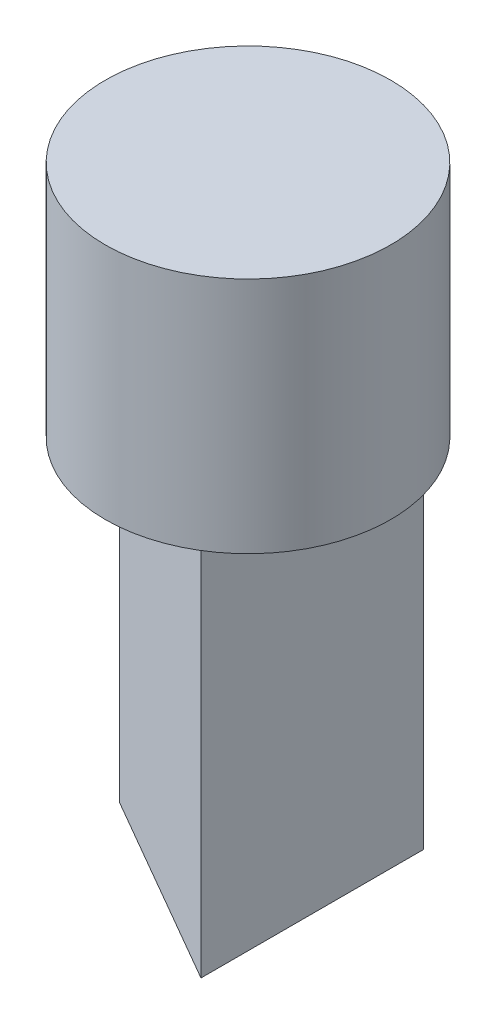
ISO-10303-21;
HEADER;
FILE_DESCRIPTION(('STEP AP214'),'2;1');
FILE_NAME('part.step','',(''),(''),'','','');
FILE_SCHEMA(('AUTOMOTIVE_DESIGN { 1 0 10303 214 1 1 1 1 }'));
ENDSEC;
DATA;
#1=APPLICATION_CONTEXT('core data for automotive mechanical design processes');
#2=APPLICATION_PROTOCOL_DEFINITION('international standard','automotive_design',2000,#1);
#3=PRODUCT_CONTEXT('',#1,'mechanical');
#4=PRODUCT('Part','Part','',(#3));
#5=PRODUCT_RELATED_PRODUCT_CATEGORY('part','',(#4));
#6=PRODUCT_DEFINITION_FORMATION('','',#4);
#7=PRODUCT_DEFINITION_CONTEXT('part definition',#1,'design');
#8=PRODUCT_DEFINITION('design','',#6,#7);
#9=PRODUCT_DEFINITION_SHAPE('','',#8);
#10=(LENGTH_UNIT() NAMED_UNIT(*) SI_UNIT(.MILLI.,.METRE.));
#11=(NAMED_UNIT(*) PLANE_ANGLE_UNIT() SI_UNIT($,.RADIAN.));
#12=(NAMED_UNIT(*) SI_UNIT($,.STERADIAN.) SOLID_ANGLE_UNIT());
#13=UNCERTAINTY_MEASURE_WITH_UNIT(LENGTH_MEASURE(1.E-05),#10,'distance_accuracy_value','');
#14=(GEOMETRIC_REPRESENTATION_CONTEXT(3) GLOBAL_UNCERTAINTY_ASSIGNED_CONTEXT((#13)) GLOBAL_UNIT_ASSIGNED_CONTEXT((#10,
#11,#12)) REPRESENTATION_CONTEXT('',''));
#15=CARTESIAN_POINT('',(0.,0.,0.));
#16=DIRECTION('',(0.,0.,1.));
#17=DIRECTION('',(1.,0.,0.));
#18=AXIS2_PLACEMENT_3D('',#15,#16,#17);
#19=CARTESIAN_POINT('',(0.,0.,0.));
#20=DIRECTION('',(0.,1.,0.));
#21=DIRECTION('',(0.,0.,1.));
#22=AXIS2_PLACEMENT_3D('',#19,#20,#21);
#23=PLANE('',#22);
#24=CARTESIAN_POINT('',(0.,0.,0.));
#25=DIRECTION('',(0.,1.,0.));
#26=DIRECTION('',(0.,0.,1.));
#27=AXIS2_PLACEMENT_3D('',#24,#25,#26);
#28=CIRCLE('',#27,3.);
#29=CARTESIAN_POINT('',(0.,0.,3.));
#30=VERTEX_POINT('',#29);
#31=EDGE_CURVE('E39',#30,#30,#28,.T.);
#32=ORIENTED_EDGE('',*,*,#31,.F.);
#33=EDGE_LOOP('',(#32));
#34=FACE_BOUND('',#33,.T.);
#35=DIRECTION('',(0.,0.,1.));
#36=VECTOR('',#35,1.);
#37=CARTESIAN_POINT('',(1.34999999999998,0.,0.));
#38=LINE('',#37,#36);
#39=CARTESIAN_POINT('',(1.34999999999998,0.,-2.338268590218));
#40=VERTEX_POINT('',#39);
#41=CARTESIAN_POINT('',(1.34999999999998,0.,2.338268590218));
#42=VERTEX_POINT('',#41);
#43=EDGE_CURVE('E50',#40,#42,#38,.T.);
#44=ORIENTED_EDGE('',*,*,#43,.F.);
#45=DIRECTION('',(0.866025403784436,0.,-0.500000000000004));
#46=VECTOR('',#45,1.);
#47=CARTESIAN_POINT('',(-0.675000000000011,0.,-1.169134295109));
#48=LINE('',#47,#46);
#49=CARTESIAN_POINT('',(-2.7,0.,0.));
#50=VERTEX_POINT('',#49);
#51=EDGE_CURVE('E85',#50,#40,#48,.T.);
#52=ORIENTED_EDGE('',*,*,#51,.F.);
#53=DIRECTION('',(-0.866025403784436,0.,-0.500000000000004));
#54=VECTOR('',#53,1.);
#55=CARTESIAN_POINT('',(-0.675000000000011,0.,1.169134295109));
#56=LINE('',#55,#54);
#57=EDGE_CURVE('E54',#42,#50,#56,.T.);
#58=ORIENTED_EDGE('',*,*,#57,.F.);
#59=EDGE_LOOP('',(#44,#52,#58));
#60=FACE_BOUND('',#59,.T.);
#61=ADVANCED_FACE('F35',(#34,#60),#23,.F.);
#62=CARTESIAN_POINT('',(0.,5.,0.));
#63=DIRECTION('',(0.,-1.,0.));
#64=DIRECTION('',(0.,0.,-1.));
#65=AXIS2_PLACEMENT_3D('',#62,#63,#64);
#66=CYLINDRICAL_SURFACE('',#65,3.);
#67=CARTESIAN_POINT('',(0.,5.,0.));
#68=DIRECTION('',(0.,1.,0.));
#69=DIRECTION('',(0.,0.,1.));
#70=AXIS2_PLACEMENT_3D('',#67,#68,#69);
#71=CIRCLE('',#70,3.);
#72=CARTESIAN_POINT('',(0.,5.,3.));
#73=VERTEX_POINT('',#72);
#74=EDGE_CURVE('E11',#73,#73,#71,.T.);
#75=ORIENTED_EDGE('',*,*,#74,.F.);
#76=EDGE_LOOP('',(#75));
#77=FACE_BOUND('',#76,.T.);
#78=ORIENTED_EDGE('',*,*,#31,.T.);
#79=EDGE_LOOP('',(#78));
#80=FACE_BOUND('',#79,.T.);
#81=ADVANCED_FACE('F37',(#77,#80),#66,.T.);
#82=CARTESIAN_POINT('',(0.,5.,0.));
#83=DIRECTION('',(0.,1.,0.));
#84=DIRECTION('',(0.,0.,1.));
#85=AXIS2_PLACEMENT_3D('',#82,#83,#84);
#86=PLANE('',#85);
#87=ORIENTED_EDGE('',*,*,#74,.T.);
#88=EDGE_LOOP('',(#87));
#89=FACE_BOUND('',#88,.T.);
#90=ADVANCED_FACE('F104',(#89),#86,.T.);
#91=CARTESIAN_POINT('',(1.34999999999998,-8.,0.));
#92=DIRECTION('',(-1.,0.,0.));
#93=DIRECTION('',(0.,0.,1.));
#94=AXIS2_PLACEMENT_3D('',#91,#92,#93);
#95=PLANE('',#94);
#96=ORIENTED_EDGE('',*,*,#43,.T.);
#97=DIRECTION('',(0.,1.,0.));
#98=VECTOR('',#97,1.);
#99=CARTESIAN_POINT('',(1.34999999999998,-8.,2.338268590218));
#100=LINE('',#99,#98);
#101=CARTESIAN_POINT('',(1.34999999999998,-8.,2.338268590218));
#102=VERTEX_POINT('',#101);
#103=EDGE_CURVE('E72',#102,#42,#100,.T.);
#104=ORIENTED_EDGE('',*,*,#103,.F.);
#105=DIRECTION('',(0.,0.,1.));
#106=VECTOR('',#105,1.);
#107=CARTESIAN_POINT('',(1.34999999999998,-8.,0.));
#108=LINE('',#107,#106);
#109=CARTESIAN_POINT('',(1.34999999999998,-8.,-2.338268590218));
#110=VERTEX_POINT('',#109);
#111=EDGE_CURVE('E78',#110,#102,#108,.T.);
#112=ORIENTED_EDGE('',*,*,#111,.F.);
#113=DIRECTION('',(0.,1.,0.));
#114=VECTOR('',#113,1.);
#115=CARTESIAN_POINT('',(1.34999999999998,-8.,-2.338268590218));
#116=LINE('',#115,#114);
#117=EDGE_CURVE('E90',#110,#40,#116,.T.);
#118=ORIENTED_EDGE('',*,*,#117,.T.);
#119=EDGE_LOOP('',(#96,#104,#112,#118));
#120=FACE_BOUND('',#119,.T.);
#121=ADVANCED_FACE('F87',(#120),#95,.F.);
#122=CARTESIAN_POINT('',(-0.675000000000011,-8.,1.169134295109));
#123=DIRECTION('',(0.500000000000004,0.,-0.866025403784436));
#124=DIRECTION('',(-0.866025403784436,0.,-0.500000000000004));
#125=AXIS2_PLACEMENT_3D('',#122,#123,#124);
#126=PLANE('',#125);
#127=ORIENTED_EDGE('',*,*,#57,.T.);
#128=DIRECTION('',(0.,1.,0.));
#129=VECTOR('',#128,1.);
#130=CARTESIAN_POINT('',(-2.7,-8.,0.));
#131=LINE('',#130,#129);
#132=CARTESIAN_POINT('',(-2.7,-8.,0.));
#133=VERTEX_POINT('',#132);
#134=EDGE_CURVE('E74',#133,#50,#131,.T.);
#135=ORIENTED_EDGE('',*,*,#134,.F.);
#136=DIRECTION('',(-0.866025403784436,0.,-0.500000000000004));
#137=VECTOR('',#136,1.);
#138=CARTESIAN_POINT('',(-0.675000000000011,-8.,1.169134295109));
#139=LINE('',#138,#137);
#140=EDGE_CURVE('E68',#102,#133,#139,.T.);
#141=ORIENTED_EDGE('',*,*,#140,.F.);
#142=ORIENTED_EDGE('',*,*,#103,.T.);
#143=EDGE_LOOP('',(#127,#135,#141,#142));
#144=FACE_BOUND('',#143,.T.);
#145=ADVANCED_FACE('F70',(#144),#126,.F.);
#146=CARTESIAN_POINT('',(-0.675000000000011,-8.,-1.169134295109));
#147=DIRECTION('',(0.500000000000004,0.,0.866025403784436));
#148=DIRECTION('',(0.866025403784436,0.,-0.500000000000004));
#149=AXIS2_PLACEMENT_3D('',#146,#147,#148);
#150=PLANE('',#149);
#151=ORIENTED_EDGE('',*,*,#51,.T.);
#152=ORIENTED_EDGE('',*,*,#117,.F.);
#153=DIRECTION('',(0.866025403784436,0.,-0.500000000000004));
#154=VECTOR('',#153,1.);
#155=CARTESIAN_POINT('',(-0.675000000000011,-8.,-1.169134295109));
#156=LINE('',#155,#154);
#157=EDGE_CURVE('E77',#133,#110,#156,.T.);
#158=ORIENTED_EDGE('',*,*,#157,.F.);
#159=ORIENTED_EDGE('',*,*,#134,.T.);
#160=EDGE_LOOP('',(#151,#152,#158,#159));
#161=FACE_BOUND('',#160,.T.);
#162=ADVANCED_FACE('F98',(#161),#150,.F.);
#163=CARTESIAN_POINT('',(0.,-8.,0.));
#164=DIRECTION('',(0.,-1.,0.));
#165=DIRECTION('',(0.,0.,-1.));
#166=AXIS2_PLACEMENT_3D('',#163,#164,#165);
#167=PLANE('',#166);
#168=ORIENTED_EDGE('',*,*,#111,.T.);
#169=ORIENTED_EDGE('',*,*,#140,.T.);
#170=ORIENTED_EDGE('',*,*,#157,.T.);
#171=EDGE_LOOP('',(#168,#169,#170));
#172=FACE_BOUND('',#171,.T.);
#173=ADVANCED_FACE('F81',(#172),#167,.T.);
#174=CLOSED_SHELL('',(#61,#81,#90,#121,#145,#162,#173));
#175=MANIFOLD_SOLID_BREP('B2',#174);
#176=ADVANCED_BREP_SHAPE_REPRESENTATION('',(#18,#175),#14);
#177=SHAPE_DEFINITION_REPRESENTATION(#9,#176);
ENDSEC;
END-ISO-10303-21;
